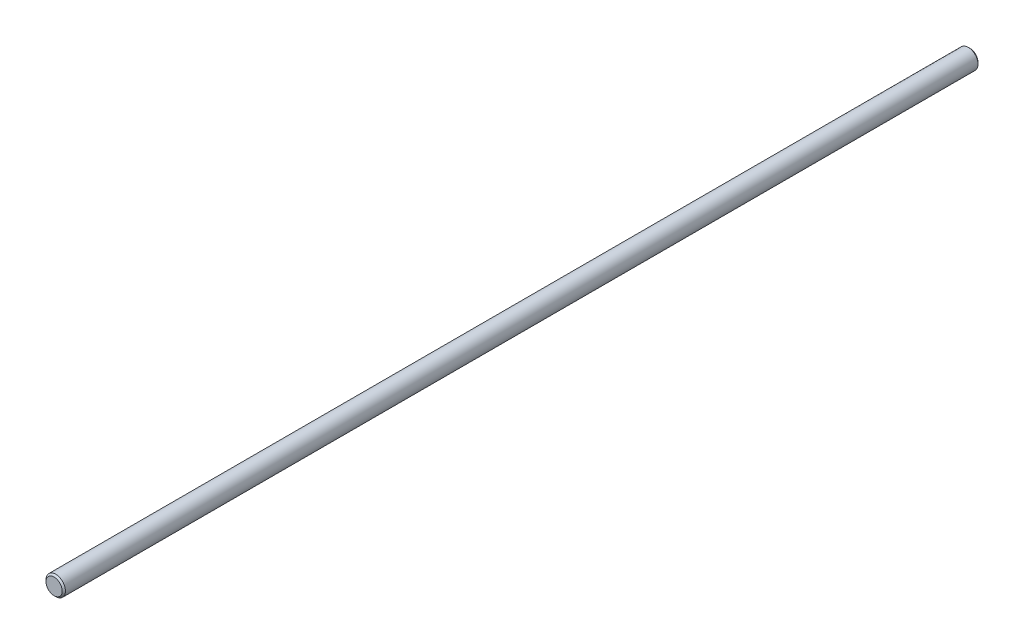
ISO-10303-21;
HEADER;
FILE_DESCRIPTION(('STEP AP214'),'2;1');
FILE_NAME('part.step','',(''),(''),'','','');
FILE_SCHEMA(('AUTOMOTIVE_DESIGN { 1 0 10303 214 1 1 1 1 }'));
ENDSEC;
DATA;
#1=APPLICATION_CONTEXT('core data for automotive mechanical design processes');
#2=APPLICATION_PROTOCOL_DEFINITION('international standard','automotive_design',2000,#1);
#3=PRODUCT_CONTEXT('',#1,'mechanical');
#4=PRODUCT('Part','Part','',(#3));
#5=PRODUCT_RELATED_PRODUCT_CATEGORY('part','',(#4));
#6=PRODUCT_DEFINITION_FORMATION('','',#4);
#7=PRODUCT_DEFINITION_CONTEXT('part definition',#1,'design');
#8=PRODUCT_DEFINITION('design','',#6,#7);
#9=PRODUCT_DEFINITION_SHAPE('','',#8);
#10=(LENGTH_UNIT() NAMED_UNIT(*) SI_UNIT(.MILLI.,.METRE.));
#11=(NAMED_UNIT(*) PLANE_ANGLE_UNIT() SI_UNIT($,.RADIAN.));
#12=(NAMED_UNIT(*) SI_UNIT($,.STERADIAN.) SOLID_ANGLE_UNIT());
#13=UNCERTAINTY_MEASURE_WITH_UNIT(LENGTH_MEASURE(1.E-05),#10,'distance_accuracy_value','');
#14=(GEOMETRIC_REPRESENTATION_CONTEXT(3) GLOBAL_UNCERTAINTY_ASSIGNED_CONTEXT((#13)) GLOBAL_UNIT_ASSIGNED_CONTEXT((#10,
#11,#12)) REPRESENTATION_CONTEXT('',''));
#15=CARTESIAN_POINT('',(0.,0.,0.));
#16=DIRECTION('',(0.,0.,1.));
#17=DIRECTION('',(1.,0.,0.));
#18=AXIS2_PLACEMENT_3D('',#15,#16,#17);
#19=CARTESIAN_POINT('',(0.,0.,-282.5));
#20=DIRECTION('',(0.,0.,1.));
#21=DIRECTION('',(1.,0.,0.));
#22=AXIS2_PLACEMENT_3D('',#19,#20,#21);
#23=CYLINDRICAL_SURFACE('',#22,3.);
#24=CARTESIAN_POINT('',(0.,0.,-282.));
#25=DIRECTION('',(0.,0.,1.));
#26=DIRECTION('',(1.,0.,0.));
#27=AXIS2_PLACEMENT_3D('',#24,#25,#26);
#28=CIRCLE('',#27,3.);
#29=CARTESIAN_POINT('',(3.,0.,-282.));
#30=VERTEX_POINT('',#29);
#31=EDGE_CURVE('E53',#30,#30,#28,.T.);
#32=ORIENTED_EDGE('',*,*,#31,.T.);
#33=EDGE_LOOP('',(#32));
#34=FACE_BOUND('',#33,.T.);
#35=CARTESIAN_POINT('',(0.,0.,-0.5));
#36=DIRECTION('',(0.,0.,1.));
#37=DIRECTION('',(1.,0.,0.));
#38=AXIS2_PLACEMENT_3D('',#35,#36,#37);
#39=CIRCLE('',#38,3.);
#40=CARTESIAN_POINT('',(3.,0.,-0.5));
#41=VERTEX_POINT('',#40);
#42=EDGE_CURVE('E58',#41,#41,#39,.F.);
#43=ORIENTED_EDGE('',*,*,#42,.T.);
#44=EDGE_LOOP('',(#43));
#45=FACE_BOUND('',#44,.T.);
#46=ADVANCED_FACE('F39',(#34,#45),#23,.T.);
#47=CARTESIAN_POINT('',(0.,0.,-282.5));
#48=DIRECTION('',(0.,0.,1.));
#49=DIRECTION('',(1.,0.,0.));
#50=AXIS2_PLACEMENT_3D('',#47,#48,#49);
#51=PLANE('',#50);
#52=CARTESIAN_POINT('',(0.,0.,-282.5));
#53=DIRECTION('',(0.,0.,1.));
#54=DIRECTION('',(1.,0.,0.));
#55=AXIS2_PLACEMENT_3D('',#52,#53,#54);
#56=CIRCLE('',#55,2.49999999999997);
#57=CARTESIAN_POINT('',(2.49999999999997,0.,-282.5));
#58=VERTEX_POINT('',#57);
#59=EDGE_CURVE('E48',#58,#58,#56,.F.);
#60=ORIENTED_EDGE('',*,*,#59,.T.);
#61=EDGE_LOOP('',(#60));
#62=FACE_BOUND('',#61,.T.);
#63=ADVANCED_FACE('F75',(#62),#51,.F.);
#64=CARTESIAN_POINT('',(0.,0.,0.));
#65=DIRECTION('',(0.,0.,1.));
#66=DIRECTION('',(1.,0.,0.));
#67=AXIS2_PLACEMENT_3D('',#64,#65,#66);
#68=PLANE('',#67);
#69=CARTESIAN_POINT('',(0.,0.,0.));
#70=DIRECTION('',(0.,0.,1.));
#71=DIRECTION('',(1.,0.,0.));
#72=AXIS2_PLACEMENT_3D('',#69,#70,#71);
#73=CIRCLE('',#72,2.5);
#74=CARTESIAN_POINT('',(2.5,0.,0.));
#75=VERTEX_POINT('',#74);
#76=EDGE_CURVE('E10',#75,#75,#73,.T.);
#77=ORIENTED_EDGE('',*,*,#76,.T.);
#78=EDGE_LOOP('',(#77));
#79=FACE_BOUND('',#78,.T.);
#80=ADVANCED_FACE('F72',(#79),#68,.T.);
#81=CARTESIAN_POINT('',(0.,0.,-282.));
#82=DIRECTION('',(0.,0.,1.));
#83=DIRECTION('',(1.,0.,0.));
#84=AXIS2_PLACEMENT_3D('',#81,#82,#83);
#85=CONICAL_SURFACE('',#84,3.,0.785398163397418);
#86=ORIENTED_EDGE('',*,*,#59,.F.);
#87=EDGE_LOOP('',(#86));
#88=FACE_BOUND('',#87,.T.);
#89=ORIENTED_EDGE('',*,*,#31,.F.);
#90=EDGE_LOOP('',(#89));
#91=FACE_BOUND('',#90,.T.);
#92=ADVANCED_FACE('F68',(#88,#91),#85,.T.);
#93=CARTESIAN_POINT('',(0.,0.,0.));
#94=DIRECTION('',(0.,0.,-1.));
#95=DIRECTION('',(-1.,0.,0.));
#96=AXIS2_PLACEMENT_3D('',#93,#94,#95);
#97=CONICAL_SURFACE('',#96,2.5,0.785398163397446);
#98=ORIENTED_EDGE('',*,*,#42,.F.);
#99=EDGE_LOOP('',(#98));
#100=FACE_BOUND('',#99,.T.);
#101=ORIENTED_EDGE('',*,*,#76,.F.);
#102=EDGE_LOOP('',(#101));
#103=FACE_BOUND('',#102,.T.);
#104=ADVANCED_FACE('F42',(#100,#103),#97,.T.);
#105=CLOSED_SHELL('',(#46,#63,#80,#92,#104));
#106=MANIFOLD_SOLID_BREP('B2',#105);
#107=ADVANCED_BREP_SHAPE_REPRESENTATION('',(#18,#106),#14);
#108=SHAPE_DEFINITION_REPRESENTATION(#9,#107);
ENDSEC;
END-ISO-10303-21;
